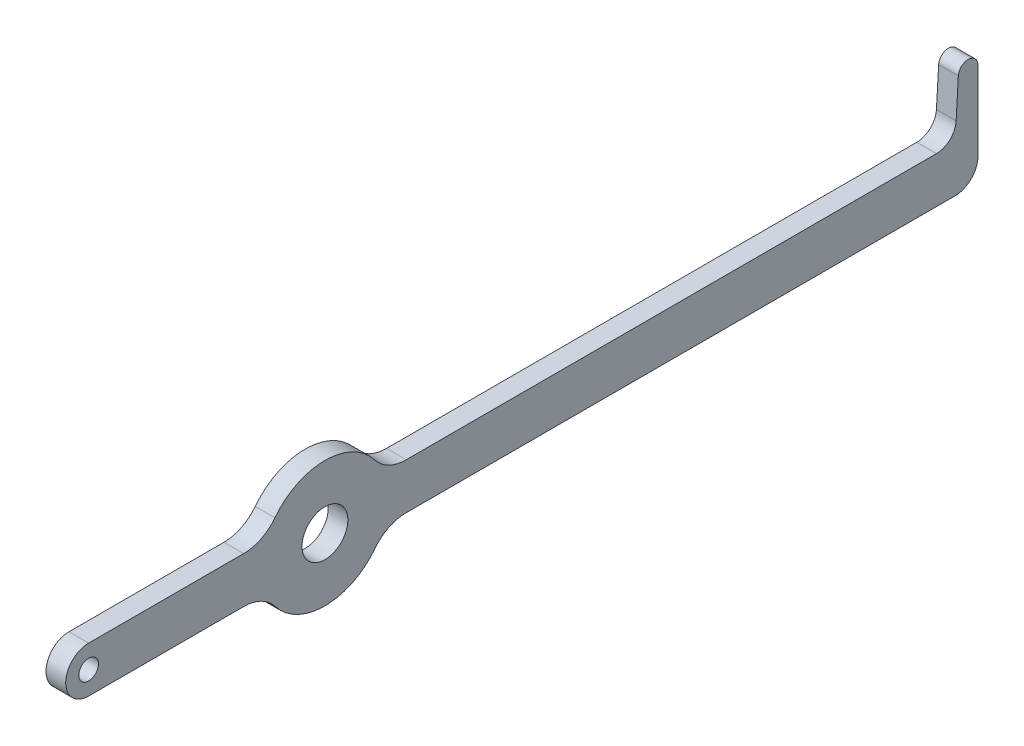
ISO-10303-21;
HEADER;
FILE_DESCRIPTION(('STEP AP214'),'2;1');
FILE_NAME('part.step','',(''),(''),'','','');
FILE_SCHEMA(('AUTOMOTIVE_DESIGN { 1 0 10303 214 1 1 1 1 }'));
ENDSEC;
DATA;
#1=APPLICATION_CONTEXT('core data for automotive mechanical design processes');
#2=APPLICATION_PROTOCOL_DEFINITION('international standard','automotive_design',2000,#1);
#3=PRODUCT_CONTEXT('',#1,'mechanical');
#4=PRODUCT('Part','Part','',(#3));
#5=PRODUCT_RELATED_PRODUCT_CATEGORY('part','',(#4));
#6=PRODUCT_DEFINITION_FORMATION('','',#4);
#7=PRODUCT_DEFINITION_CONTEXT('part definition',#1,'design');
#8=PRODUCT_DEFINITION('design','',#6,#7);
#9=PRODUCT_DEFINITION_SHAPE('','',#8);
#10=(LENGTH_UNIT() NAMED_UNIT(*) SI_UNIT(.MILLI.,.METRE.));
#11=(NAMED_UNIT(*) PLANE_ANGLE_UNIT() SI_UNIT($,.RADIAN.));
#12=(NAMED_UNIT(*) SI_UNIT($,.STERADIAN.) SOLID_ANGLE_UNIT());
#13=UNCERTAINTY_MEASURE_WITH_UNIT(LENGTH_MEASURE(1.E-05),#10,'distance_accuracy_value','');
#14=(GEOMETRIC_REPRESENTATION_CONTEXT(3) GLOBAL_UNCERTAINTY_ASSIGNED_CONTEXT((#13)) GLOBAL_UNIT_ASSIGNED_CONTEXT((#10,
#11,#12)) REPRESENTATION_CONTEXT('',''));
#15=CARTESIAN_POINT('',(0.,0.,0.));
#16=DIRECTION('',(0.,0.,1.));
#17=DIRECTION('',(1.,0.,0.));
#18=AXIS2_PLACEMENT_3D('',#15,#16,#17);
#19=CARTESIAN_POINT('',(1.5875,0.,-101.6));
#20=DIRECTION('',(-1.,0.,0.));
#21=DIRECTION('',(0.,0.,1.));
#22=AXIS2_PLACEMENT_3D('',#19,#20,#21);
#23=CYLINDRICAL_SURFACE('',#22,3.69803375805953);
#24=DIRECTION('',(1.,0.,0.));
#25=VECTOR('',#24,1.);
#26=CARTESIAN_POINT('',(-1.5875,0.,-105.29803375806));
#27=LINE('',#26,#25);
#28=CARTESIAN_POINT('',(-1.5875,0.,-105.29803375806));
#29=VERTEX_POINT('',#28);
#30=CARTESIAN_POINT('',(1.5875,0.,-105.29803375806));
#31=VERTEX_POINT('',#30);
#32=EDGE_CURVE('E170',#29,#31,#27,.T.);
#33=ORIENTED_EDGE('',*,*,#32,.T.);
#34=CARTESIAN_POINT('',(1.5875,0.,-101.6));
#35=DIRECTION('',(1.,0.,0.));
#36=DIRECTION('',(0.,0.,-1.));
#37=AXIS2_PLACEMENT_3D('',#34,#35,#36);
#38=CIRCLE('',#37,3.69803375805953);
#39=CARTESIAN_POINT('',(1.5875,-3.69803375805953,-101.6));
#40=VERTEX_POINT('',#39);
#41=EDGE_CURVE('E351',#40,#31,#38,.T.);
#42=ORIENTED_EDGE('',*,*,#41,.F.);
#43=DIRECTION('',(-1.,0.,0.));
#44=VECTOR('',#43,1.);
#45=CARTESIAN_POINT('',(1.5875,-3.69803375805953,-101.6));
#46=LINE('',#45,#44);
#47=CARTESIAN_POINT('',(-1.5875,-3.69803375805953,-101.6));
#48=VERTEX_POINT('',#47);
#49=EDGE_CURVE('E277',#40,#48,#46,.T.);
#50=ORIENTED_EDGE('',*,*,#49,.T.);
#51=CARTESIAN_POINT('',(-1.5875,0.,-101.6));
#52=DIRECTION('',(1.,0.,0.));
#53=DIRECTION('',(0.,0.,-1.));
#54=AXIS2_PLACEMENT_3D('',#51,#52,#53);
#55=CIRCLE('',#54,3.69803375805953);
#56=EDGE_CURVE('E247',#48,#29,#55,.T.);
#57=ORIENTED_EDGE('',*,*,#56,.T.);
#58=EDGE_LOOP('',(#33,#42,#50,#57));
#59=FACE_BOUND('',#58,.T.);
#60=ADVANCED_FACE('F44',(#59),#23,.T.);
#61=CARTESIAN_POINT('',(1.5875,0.,0.));
#62=DIRECTION('',(-1.,0.,0.));
#63=DIRECTION('',(0.,0.,1.));
#64=AXIS2_PLACEMENT_3D('',#61,#62,#63);
#65=CYLINDRICAL_SURFACE('',#64,10.16);
#66=CARTESIAN_POINT('',(-1.5875,0.,0.));
#67=DIRECTION('',(1.,0.,0.));
#68=DIRECTION('',(0.,0.,-1.));
#69=AXIS2_PLACEMENT_3D('',#66,#67,#68);
#70=CIRCLE('',#69,10.16);
#71=CARTESIAN_POINT('',(-1.5875,-6.1834053895751,8.06170563765347));
#72=VERTEX_POINT('',#71);
#73=CARTESIAN_POINT('',(-1.5875,-6.1834053895751,-8.06170563765347));
#74=VERTEX_POINT('',#73);
#75=EDGE_CURVE('E212',#72,#74,#70,.T.);
#76=ORIENTED_EDGE('',*,*,#75,.T.);
#77=DIRECTION('',(-1.,0.,0.));
#78=VECTOR('',#77,1.);
#79=CARTESIAN_POINT('',(1.5875,-6.1834053895751,-8.06170563765347));
#80=LINE('',#79,#78);
#81=CARTESIAN_POINT('',(1.5875,-6.1834053895751,-8.06170563765347));
#82=VERTEX_POINT('',#81);
#83=EDGE_CURVE('E299',#74,#82,#80,.F.);
#84=ORIENTED_EDGE('',*,*,#83,.T.);
#85=CARTESIAN_POINT('',(1.5875,0.,0.));
#86=DIRECTION('',(1.,0.,0.));
#87=DIRECTION('',(0.,0.,-1.));
#88=AXIS2_PLACEMENT_3D('',#85,#86,#87);
#89=CIRCLE('',#88,10.16);
#90=CARTESIAN_POINT('',(1.5875,-6.1834053895751,8.06170563765347));
#91=VERTEX_POINT('',#90);
#92=EDGE_CURVE('E216',#91,#82,#89,.T.);
#93=ORIENTED_EDGE('',*,*,#92,.F.);
#94=DIRECTION('',(-1.,0.,0.));
#95=VECTOR('',#94,1.);
#96=CARTESIAN_POINT('',(1.5875,-6.1834053895751,8.06170563765347));
#97=LINE('',#96,#95);
#98=EDGE_CURVE('E295',#91,#72,#97,.T.);
#99=ORIENTED_EDGE('',*,*,#98,.T.);
#100=EDGE_LOOP('',(#76,#84,#93,#99));
#101=FACE_BOUND('',#100,.T.);
#102=ADVANCED_FACE('F370',(#101),#65,.T.);
#103=CARTESIAN_POINT('',(1.5875,-3.69803375805953,0.));
#104=DIRECTION('',(0.,1.,0.));
#105=DIRECTION('',(0.,0.,1.));
#106=AXIS2_PLACEMENT_3D('',#103,#104,#105);
#107=PLANE('',#106);
#108=DIRECTION('',(0.,0.,-1.));
#109=VECTOR('',#108,1.);
#110=CARTESIAN_POINT('',(1.5875,-3.69803375805953,0.));
#111=LINE('',#110,#109);
#112=CARTESIAN_POINT('',(1.5875,-3.69803375805953,-13.1002716611869));
#113=VERTEX_POINT('',#112);
#114=EDGE_CURVE('E221',#113,#40,#111,.T.);
#115=ORIENTED_EDGE('',*,*,#114,.F.);
#116=DIRECTION('',(1.,0.,0.));
#117=VECTOR('',#116,1.);
#118=CARTESIAN_POINT('',(-1.5875,-3.69803375805953,-13.1002716611869));
#119=LINE('',#118,#117);
#120=CARTESIAN_POINT('',(-1.5875,-3.69803375805953,-13.1002716611869));
#121=VERTEX_POINT('',#120);
#122=EDGE_CURVE('E291',#113,#121,#119,.F.);
#123=ORIENTED_EDGE('',*,*,#122,.T.);
#124=DIRECTION('',(0.,0.,-1.));
#125=VECTOR('',#124,1.);
#126=CARTESIAN_POINT('',(-1.5875,-3.69803375805953,0.));
#127=LINE('',#126,#125);
#128=EDGE_CURVE('E244',#121,#48,#127,.T.);
#129=ORIENTED_EDGE('',*,*,#128,.T.);
#130=ORIENTED_EDGE('',*,*,#49,.F.);
#131=EDGE_LOOP('',(#115,#123,#129,#130));
#132=FACE_BOUND('',#131,.T.);
#133=ADVANCED_FACE('F364',(#132),#107,.F.);
#134=CARTESIAN_POINT('',(1.5875,3.69803375805953,0.));
#135=DIRECTION('',(0.,1.,0.));
#136=DIRECTION('',(0.,0.,1.));
#137=AXIS2_PLACEMENT_3D('',#134,#135,#136);
#138=PLANE('',#137);
#139=DIRECTION('',(0.,0.,-1.));
#140=VECTOR('',#139,1.);
#141=CARTESIAN_POINT('',(1.5875,3.69803375805953,0.));
#142=LINE('',#141,#140);
#143=CARTESIAN_POINT('',(1.5875,3.69803375805953,-13.1002716611869));
#144=VERTEX_POINT('',#143);
#145=CARTESIAN_POINT('',(1.5875,3.69803375805953,-98.6032390425791));
#146=VERTEX_POINT('',#145);
#147=EDGE_CURVE('E347',#144,#146,#142,.T.);
#148=ORIENTED_EDGE('',*,*,#147,.T.);
#149=DIRECTION('',(-1.,0.,0.));
#150=VECTOR('',#149,1.);
#151=CARTESIAN_POINT('',(-1.5875,3.69803375805953,-98.6032390425791));
#152=LINE('',#151,#150);
#153=CARTESIAN_POINT('',(-1.5875,3.69803375805953,-98.6032390425791));
#154=VERTEX_POINT('',#153);
#155=EDGE_CURVE('E333',#146,#154,#152,.T.);
#156=ORIENTED_EDGE('',*,*,#155,.T.);
#157=DIRECTION('',(0.,0.,-1.));
#158=VECTOR('',#157,1.);
#159=CARTESIAN_POINT('',(-1.5875,3.69803375805953,0.));
#160=LINE('',#159,#158);
#161=CARTESIAN_POINT('',(-1.5875,3.69803375805953,-13.1002716611869));
#162=VERTEX_POINT('',#161);
#163=EDGE_CURVE('E250',#162,#154,#160,.T.);
#164=ORIENTED_EDGE('',*,*,#163,.F.);
#165=DIRECTION('',(-1.,0.,0.));
#166=VECTOR('',#165,1.);
#167=CARTESIAN_POINT('',(1.5875,3.69803375805953,-13.1002716611869));
#168=LINE('',#167,#166);
#169=EDGE_CURVE('E288',#162,#144,#168,.F.);
#170=ORIENTED_EDGE('',*,*,#169,.T.);
#171=EDGE_LOOP('',(#148,#156,#164,#170));
#172=FACE_BOUND('',#171,.T.);
#173=ADVANCED_FACE('F395',(#172),#138,.T.);
#174=CARTESIAN_POINT('',(1.5875,0.,0.));
#175=DIRECTION('',(-1.,0.,0.));
#176=DIRECTION('',(0.,0.,1.));
#177=AXIS2_PLACEMENT_3D('',#174,#175,#176);
#178=CYLINDRICAL_SURFACE('',#177,10.16);
#179=CARTESIAN_POINT('',(1.5875,0.,0.));
#180=DIRECTION('',(1.,0.,0.));
#181=DIRECTION('',(0.,0.,-1.));
#182=AXIS2_PLACEMENT_3D('',#179,#180,#181);
#183=CIRCLE('',#182,10.16);
#184=CARTESIAN_POINT('',(1.5875,6.1834053895751,-8.06170563765347));
#185=VERTEX_POINT('',#184);
#186=CARTESIAN_POINT('',(1.5875,6.1834053895751,8.06170563765347));
#187=VERTEX_POINT('',#186);
#188=EDGE_CURVE('E344',#185,#187,#183,.T.);
#189=ORIENTED_EDGE('',*,*,#188,.F.);
#190=DIRECTION('',(-1.,0.,0.));
#191=VECTOR('',#190,1.);
#192=CARTESIAN_POINT('',(1.5875,6.1834053895751,-8.06170563765347));
#193=LINE('',#192,#191);
#194=CARTESIAN_POINT('',(-1.5875,6.1834053895751,-8.06170563765347));
#195=VERTEX_POINT('',#194);
#196=EDGE_CURVE('E284',#185,#195,#193,.T.);
#197=ORIENTED_EDGE('',*,*,#196,.T.);
#198=CARTESIAN_POINT('',(-1.5875,0.,0.));
#199=DIRECTION('',(1.,0.,0.));
#200=DIRECTION('',(0.,0.,-1.));
#201=AXIS2_PLACEMENT_3D('',#198,#199,#200);
#202=CIRCLE('',#201,10.16);
#203=CARTESIAN_POINT('',(-1.5875,6.1834053895751,8.06170563765347));
#204=VERTEX_POINT('',#203);
#205=EDGE_CURVE('E253',#195,#204,#202,.T.);
#206=ORIENTED_EDGE('',*,*,#205,.T.);
#207=DIRECTION('',(-1.,0.,0.));
#208=VECTOR('',#207,1.);
#209=CARTESIAN_POINT('',(1.5875,6.1834053895751,8.06170563765347));
#210=LINE('',#209,#208);
#211=EDGE_CURVE('E281',#204,#187,#210,.F.);
#212=ORIENTED_EDGE('',*,*,#211,.T.);
#213=EDGE_LOOP('',(#189,#197,#206,#212));
#214=FACE_BOUND('',#213,.T.);
#215=ADVANCED_FACE('F401',(#214),#178,.T.);
#216=CARTESIAN_POINT('',(1.5875,3.69803375805953,0.));
#217=DIRECTION('',(0.,-1.,0.));
#218=DIRECTION('',(0.,0.,-1.));
#219=AXIS2_PLACEMENT_3D('',#216,#217,#218);
#220=PLANE('',#219);
#221=DIRECTION('',(0.,0.,1.));
#222=VECTOR('',#221,1.);
#223=CARTESIAN_POINT('',(1.5875,3.69803375805953,0.));
#224=LINE('',#223,#222);
#225=CARTESIAN_POINT('',(1.5875,3.69803375805953,13.1002716611869));
#226=VERTEX_POINT('',#225);
#227=CARTESIAN_POINT('',(1.5875,3.69803375805953,38.1));
#228=VERTEX_POINT('',#227);
#229=EDGE_CURVE('E342',#226,#228,#224,.T.);
#230=ORIENTED_EDGE('',*,*,#229,.F.);
#231=DIRECTION('',(1.,0.,0.));
#232=VECTOR('',#231,1.);
#233=CARTESIAN_POINT('',(-1.5875,3.69803375805953,13.1002716611869));
#234=LINE('',#233,#232);
#235=CARTESIAN_POINT('',(-1.5875,3.69803375805953,13.1002716611869));
#236=VERTEX_POINT('',#235);
#237=EDGE_CURVE('E305',#226,#236,#234,.F.);
#238=ORIENTED_EDGE('',*,*,#237,.T.);
#239=DIRECTION('',(0.,0.,1.));
#240=VECTOR('',#239,1.);
#241=CARTESIAN_POINT('',(-1.5875,3.69803375805953,0.));
#242=LINE('',#241,#240);
#243=CARTESIAN_POINT('',(-1.5875,3.69803375805953,38.1));
#244=VERTEX_POINT('',#243);
#245=EDGE_CURVE('E257',#236,#244,#242,.T.);
#246=ORIENTED_EDGE('',*,*,#245,.T.);
#247=DIRECTION('',(-1.,0.,0.));
#248=VECTOR('',#247,1.);
#249=CARTESIAN_POINT('',(1.5875,3.69803375805953,38.1));
#250=LINE('',#249,#248);
#251=EDGE_CURVE('E273',#228,#244,#250,.T.);
#252=ORIENTED_EDGE('',*,*,#251,.F.);
#253=EDGE_LOOP('',(#230,#238,#246,#252));
#254=FACE_BOUND('',#253,.T.);
#255=ADVANCED_FACE('F406',(#254),#220,.F.);
#256=CARTESIAN_POINT('',(1.5875,0.,38.1));
#257=DIRECTION('',(-1.,0.,0.));
#258=DIRECTION('',(0.,0.,1.));
#259=AXIS2_PLACEMENT_3D('',#256,#257,#258);
#260=CYLINDRICAL_SURFACE('',#259,3.69803375805953);
#261=CARTESIAN_POINT('',(-1.5875,0.,38.1));
#262=DIRECTION('',(1.,0.,0.));
#263=DIRECTION('',(0.,0.,-1.));
#264=AXIS2_PLACEMENT_3D('',#261,#262,#263);
#265=CIRCLE('',#264,3.69803375805953);
#266=CARTESIAN_POINT('',(-1.5875,-3.69803375805953,38.1));
#267=VERTEX_POINT('',#266);
#268=EDGE_CURVE('E260',#244,#267,#265,.T.);
#269=ORIENTED_EDGE('',*,*,#268,.T.);
#270=DIRECTION('',(-1.,0.,0.));
#271=VECTOR('',#270,1.);
#272=CARTESIAN_POINT('',(1.5875,-3.69803375805953,38.1));
#273=LINE('',#272,#271);
#274=CARTESIAN_POINT('',(1.5875,-3.69803375805953,38.1));
#275=VERTEX_POINT('',#274);
#276=EDGE_CURVE('E240',#275,#267,#273,.T.);
#277=ORIENTED_EDGE('',*,*,#276,.F.);
#278=CARTESIAN_POINT('',(1.5875,0.,38.1));
#279=DIRECTION('',(1.,0.,0.));
#280=DIRECTION('',(0.,0.,-1.));
#281=AXIS2_PLACEMENT_3D('',#278,#279,#280);
#282=CIRCLE('',#281,3.69803375805953);
#283=EDGE_CURVE('E233',#228,#275,#282,.T.);
#284=ORIENTED_EDGE('',*,*,#283,.F.);
#285=ORIENTED_EDGE('',*,*,#251,.T.);
#286=EDGE_LOOP('',(#269,#277,#284,#285));
#287=FACE_BOUND('',#286,.T.);
#288=ADVANCED_FACE('F442',(#287),#260,.T.);
#289=CARTESIAN_POINT('',(1.5875,-3.69803375805953,0.));
#290=DIRECTION('',(0.,-1.,0.));
#291=DIRECTION('',(0.,0.,-1.));
#292=AXIS2_PLACEMENT_3D('',#289,#290,#291);
#293=PLANE('',#292);
#294=DIRECTION('',(0.,0.,1.));
#295=VECTOR('',#294,1.);
#296=CARTESIAN_POINT('',(-1.5875,-3.69803375805953,0.));
#297=LINE('',#296,#295);
#298=CARTESIAN_POINT('',(-1.5875,-3.69803375805953,13.1002716611869));
#299=VERTEX_POINT('',#298);
#300=EDGE_CURVE('E264',#299,#267,#297,.T.);
#301=ORIENTED_EDGE('',*,*,#300,.F.);
#302=DIRECTION('',(-1.,0.,0.));
#303=VECTOR('',#302,1.);
#304=CARTESIAN_POINT('',(1.5875,-3.69803375805953,13.1002716611869));
#305=LINE('',#304,#303);
#306=CARTESIAN_POINT('',(1.5875,-3.69803375805953,13.1002716611869));
#307=VERTEX_POINT('',#306);
#308=EDGE_CURVE('E302',#299,#307,#305,.F.);
#309=ORIENTED_EDGE('',*,*,#308,.T.);
#310=DIRECTION('',(0.,0.,1.));
#311=VECTOR('',#310,1.);
#312=CARTESIAN_POINT('',(1.5875,-3.69803375805953,0.));
#313=LINE('',#312,#311);
#314=EDGE_CURVE('E228',#307,#275,#313,.T.);
#315=ORIENTED_EDGE('',*,*,#314,.T.);
#316=ORIENTED_EDGE('',*,*,#276,.T.);
#317=EDGE_LOOP('',(#301,#309,#315,#316));
#318=FACE_BOUND('',#317,.T.);
#319=ADVANCED_FACE('F438',(#318),#293,.T.);
#320=CARTESIAN_POINT('',(1.5875,0.,0.));
#321=DIRECTION('',(-1.,0.,0.));
#322=DIRECTION('',(0.,0.,1.));
#323=AXIS2_PLACEMENT_3D('',#320,#321,#322);
#324=CYLINDRICAL_SURFACE('',#323,3.69803375805953);
#325=CARTESIAN_POINT('',(1.5875,0.,0.));
#326=DIRECTION('',(1.,0.,0.));
#327=DIRECTION('',(0.,0.,-1.));
#328=AXIS2_PLACEMENT_3D('',#325,#326,#327);
#329=CIRCLE('',#328,3.69803375805953);
#330=CARTESIAN_POINT('',(1.5875,0.,-3.69803375805953));
#331=VERTEX_POINT('',#330);
#332=EDGE_CURVE('E232',#331,#331,#329,.T.);
#333=ORIENTED_EDGE('',*,*,#332,.T.);
#334=EDGE_LOOP('',(#333));
#335=FACE_BOUND('',#334,.T.);
#336=CARTESIAN_POINT('',(-1.5875,0.,0.));
#337=DIRECTION('',(1.,0.,0.));
#338=DIRECTION('',(0.,0.,-1.));
#339=AXIS2_PLACEMENT_3D('',#336,#337,#338);
#340=CIRCLE('',#339,3.69803375805953);
#341=CARTESIAN_POINT('',(-1.5875,0.,-3.69803375805953));
#342=VERTEX_POINT('',#341);
#343=EDGE_CURVE('E222',#342,#342,#340,.T.);
#344=ORIENTED_EDGE('',*,*,#343,.F.);
#345=EDGE_LOOP('',(#344));
#346=FACE_BOUND('',#345,.T.);
#347=ADVANCED_FACE('F431',(#335,#346),#324,.F.);
#348=CARTESIAN_POINT('',(1.5875,0.,0.));
#349=DIRECTION('',(1.,0.,0.));
#350=DIRECTION('',(0.,0.,-1.));
#351=AXIS2_PLACEMENT_3D('',#348,#349,#350);
#352=PLANE('',#351);
#353=CARTESIAN_POINT('',(1.5875,0.,38.1));
#354=DIRECTION('',(1.,0.,0.));
#355=DIRECTION('',(0.,0.,-1.));
#356=AXIS2_PLACEMENT_3D('',#353,#354,#355);
#357=CIRCLE('',#356,1.5875);
#358=CARTESIAN_POINT('',(1.5875,0.,36.5125));
#359=VERTEX_POINT('',#358);
#360=EDGE_CURVE('E189',#359,#359,#357,.T.);
#361=ORIENTED_EDGE('',*,*,#360,.F.);
#362=EDGE_LOOP('',(#361));
#363=FACE_BOUND('',#362,.T.);
#364=ORIENTED_EDGE('',*,*,#314,.F.);
#365=CARTESIAN_POINT('',(1.5875,-10.0480337580595,13.1002716611869));
#366=DIRECTION('',(1.,0.,0.));
#367=DIRECTION('',(0.,0.,-1.));
#368=AXIS2_PLACEMENT_3D('',#365,#366,#367);
#369=CIRCLE('',#368,6.35);
#370=EDGE_CURVE('E324',#307,#91,#369,.F.);
#371=ORIENTED_EDGE('',*,*,#370,.T.);
#372=ORIENTED_EDGE('',*,*,#92,.T.);
#373=CARTESIAN_POINT('',(1.5875,-10.0480337580595,-13.1002716611869));
#374=DIRECTION('',(1.,0.,0.));
#375=DIRECTION('',(0.,0.,-1.));
#376=AXIS2_PLACEMENT_3D('',#373,#374,#375);
#377=CIRCLE('',#376,6.35);
#378=EDGE_CURVE('E318',#82,#113,#377,.F.);
#379=ORIENTED_EDGE('',*,*,#378,.T.);
#380=ORIENTED_EDGE('',*,*,#114,.T.);
#381=ORIENTED_EDGE('',*,*,#41,.T.);
#382=DIRECTION('',(0.,1.,0.));
#383=VECTOR('',#382,1.);
#384=CARTESIAN_POINT('',(1.5875,0.,-105.29803375806));
#385=LINE('',#384,#383);
#386=CARTESIAN_POINT('',(1.5875,12.7,-105.29803375806));
#387=VERTEX_POINT('',#386);
#388=EDGE_CURVE('E195',#31,#387,#385,.T.);
#389=ORIENTED_EDGE('',*,*,#388,.T.);
#390=CARTESIAN_POINT('',(1.5875,12.7,-103.71053375806));
#391=DIRECTION('',(1.,0.,0.));
#392=DIRECTION('',(0.,0.,-1.));
#393=AXIS2_PLACEMENT_3D('',#390,#391,#392);
#394=CIRCLE('',#393,1.58750000000001);
#395=CARTESIAN_POINT('',(1.5875,12.791616860415,-102.125679632));
#396=VERTEX_POINT('',#395);
#397=EDGE_CURVE('E163',#387,#396,#394,.T.);
#398=ORIENTED_EDGE('',*,*,#397,.T.);
#399=DIRECTION('',(0.,-0.998333307753991,0.0577114081354328));
#400=VECTOR('',#399,1.);
#401=CARTESIAN_POINT('',(1.5875,3.69803375805953,-101.6));
#402=LINE('',#401,#400);
#403=CARTESIAN_POINT('',(1.5875,6.68980003722953,-101.772947294698));
#404=VERTEX_POINT('',#403);
#405=EDGE_CURVE('E184',#396,#404,#402,.T.);
#406=ORIENTED_EDGE('',*,*,#405,.T.);
#407=CARTESIAN_POINT('',(1.5875,6.87303375805953,-98.6032390425791));
#408=DIRECTION('',(1.,0.,0.));
#409=DIRECTION('',(0.,0.,-1.));
#410=AXIS2_PLACEMENT_3D('',#407,#408,#409);
#411=CIRCLE('',#410,3.175);
#412=EDGE_CURVE('E12',#404,#146,#411,.F.);
#413=ORIENTED_EDGE('',*,*,#412,.T.);
#414=ORIENTED_EDGE('',*,*,#147,.F.);
#415=CARTESIAN_POINT('',(1.5875,10.0480337580595,-13.1002716611869));
#416=DIRECTION('',(1.,0.,0.));
#417=DIRECTION('',(0.,0.,-1.));
#418=AXIS2_PLACEMENT_3D('',#415,#416,#417);
#419=CIRCLE('',#418,6.35);
#420=EDGE_CURVE('E312',#144,#185,#419,.F.);
#421=ORIENTED_EDGE('',*,*,#420,.T.);
#422=ORIENTED_EDGE('',*,*,#188,.T.);
#423=CARTESIAN_POINT('',(1.5875,10.0480337580595,13.1002716611869));
#424=DIRECTION('',(1.,0.,0.));
#425=DIRECTION('',(0.,0.,-1.));
#426=AXIS2_PLACEMENT_3D('',#423,#424,#425);
#427=CIRCLE('',#426,6.35);
#428=EDGE_CURVE('E330',#187,#226,#427,.F.);
#429=ORIENTED_EDGE('',*,*,#428,.T.);
#430=ORIENTED_EDGE('',*,*,#229,.T.);
#431=ORIENTED_EDGE('',*,*,#283,.T.);
#432=EDGE_LOOP('',(#364,#371,#372,#379,#380,#381,#389,#398,#406,#413,#414,#421,#422,#429,#430,#431));
#433=FACE_BOUND('',#432,.T.);
#434=ORIENTED_EDGE('',*,*,#332,.F.);
#435=EDGE_LOOP('',(#434));
#436=FACE_BOUND('',#435,.T.);
#437=ADVANCED_FACE('F358',(#363,#433,#436),#352,.T.);
#438=CARTESIAN_POINT('',(-1.5875,0.,0.));
#439=DIRECTION('',(1.,0.,0.));
#440=DIRECTION('',(0.,0.,-1.));
#441=AXIS2_PLACEMENT_3D('',#438,#439,#440);
#442=PLANE('',#441);
#443=CARTESIAN_POINT('',(-1.5875,0.,38.1));
#444=DIRECTION('',(1.,0.,0.));
#445=DIRECTION('',(0.,0.,-1.));
#446=AXIS2_PLACEMENT_3D('',#443,#444,#445);
#447=CIRCLE('',#446,1.5875);
#448=CARTESIAN_POINT('',(-1.5875,0.,36.5125));
#449=VERTEX_POINT('',#448);
#450=EDGE_CURVE('E560',#449,#449,#447,.T.);
#451=ORIENTED_EDGE('',*,*,#450,.T.);
#452=EDGE_LOOP('',(#451));
#453=FACE_BOUND('',#452,.T.);
#454=ORIENTED_EDGE('',*,*,#75,.F.);
#455=CARTESIAN_POINT('',(-1.5875,-10.0480337580595,13.1002716611869));
#456=DIRECTION('',(1.,0.,0.));
#457=DIRECTION('',(0.,0.,-1.));
#458=AXIS2_PLACEMENT_3D('',#455,#456,#457);
#459=CIRCLE('',#458,6.35);
#460=EDGE_CURVE('E321',#72,#299,#459,.T.);
#461=ORIENTED_EDGE('',*,*,#460,.T.);
#462=ORIENTED_EDGE('',*,*,#300,.T.);
#463=ORIENTED_EDGE('',*,*,#268,.F.);
#464=ORIENTED_EDGE('',*,*,#245,.F.);
#465=CARTESIAN_POINT('',(-1.5875,10.0480337580595,13.1002716611869));
#466=DIRECTION('',(1.,0.,0.));
#467=DIRECTION('',(0.,0.,-1.));
#468=AXIS2_PLACEMENT_3D('',#465,#466,#467);
#469=CIRCLE('',#468,6.35);
#470=EDGE_CURVE('E327',#236,#204,#469,.T.);
#471=ORIENTED_EDGE('',*,*,#470,.T.);
#472=ORIENTED_EDGE('',*,*,#205,.F.);
#473=CARTESIAN_POINT('',(-1.5875,10.0480337580595,-13.1002716611869));
#474=DIRECTION('',(1.,0.,0.));
#475=DIRECTION('',(0.,0.,-1.));
#476=AXIS2_PLACEMENT_3D('',#473,#474,#475);
#477=CIRCLE('',#476,6.35);
#478=EDGE_CURVE('E309',#195,#162,#477,.T.);
#479=ORIENTED_EDGE('',*,*,#478,.T.);
#480=ORIENTED_EDGE('',*,*,#163,.T.);
#481=CARTESIAN_POINT('',(-1.5875,6.87303375805953,-98.6032390425791));
#482=DIRECTION('',(1.,0.,0.));
#483=DIRECTION('',(0.,0.,-1.));
#484=AXIS2_PLACEMENT_3D('',#481,#482,#483);
#485=CIRCLE('',#484,3.175);
#486=CARTESIAN_POINT('',(-1.5875,6.68980003722953,-101.772947294698));
#487=VERTEX_POINT('',#486);
#488=EDGE_CURVE('E53',#154,#487,#485,.T.);
#489=ORIENTED_EDGE('',*,*,#488,.T.);
#490=DIRECTION('',(0.,-0.998333307753991,0.0577114081354328));
#491=VECTOR('',#490,1.);
#492=CARTESIAN_POINT('',(-1.5875,3.69803375805953,-101.6));
#493=LINE('',#492,#491);
#494=CARTESIAN_POINT('',(-1.5875,12.791616860415,-102.125679632));
#495=VERTEX_POINT('',#494);
#496=EDGE_CURVE('E178',#495,#487,#493,.T.);
#497=ORIENTED_EDGE('',*,*,#496,.F.);
#498=CARTESIAN_POINT('',(-1.5875,12.7,-103.71053375806));
#499=DIRECTION('',(1.,0.,0.));
#500=DIRECTION('',(0.,0.,-1.));
#501=AXIS2_PLACEMENT_3D('',#498,#499,#500);
#502=CIRCLE('',#501,1.58750000000001);
#503=CARTESIAN_POINT('',(-1.5875,12.7,-105.29803375806));
#504=VERTEX_POINT('',#503);
#505=EDGE_CURVE('E161',#504,#495,#502,.T.);
#506=ORIENTED_EDGE('',*,*,#505,.F.);
#507=DIRECTION('',(0.,1.,0.));
#508=VECTOR('',#507,1.);
#509=CARTESIAN_POINT('',(-1.5875,0.,-105.29803375806));
#510=LINE('',#509,#508);
#511=EDGE_CURVE('E177',#29,#504,#510,.T.);
#512=ORIENTED_EDGE('',*,*,#511,.F.);
#513=ORIENTED_EDGE('',*,*,#56,.F.);
#514=ORIENTED_EDGE('',*,*,#128,.F.);
#515=CARTESIAN_POINT('',(-1.5875,-10.0480337580595,-13.1002716611869));
#516=DIRECTION('',(1.,0.,0.));
#517=DIRECTION('',(0.,0.,-1.));
#518=AXIS2_PLACEMENT_3D('',#515,#516,#517);
#519=CIRCLE('',#518,6.35);
#520=EDGE_CURVE('E315',#121,#74,#519,.T.);
#521=ORIENTED_EDGE('',*,*,#520,.T.);
#522=EDGE_LOOP('',(#454,#461,#462,#463,#464,#471,#472,#479,#480,#489,#497,#506,#512,#513,#514,#521));
#523=FACE_BOUND('',#522,.T.);
#524=ORIENTED_EDGE('',*,*,#343,.T.);
#525=EDGE_LOOP('',(#524));
#526=FACE_BOUND('',#525,.T.);
#527=ADVANCED_FACE('F174',(#453,#523,#526),#442,.F.);
#528=CARTESIAN_POINT('',(1.5875,10.0480337580595,-13.1002716611869));
#529=DIRECTION('',(-1.,0.,0.));
#530=DIRECTION('',(0.,0.,1.));
#531=AXIS2_PLACEMENT_3D('',#528,#529,#530);
#532=CYLINDRICAL_SURFACE('',#531,6.35);
#533=ORIENTED_EDGE('',*,*,#420,.F.);
#534=ORIENTED_EDGE('',*,*,#169,.F.);
#535=ORIENTED_EDGE('',*,*,#478,.F.);
#536=ORIENTED_EDGE('',*,*,#196,.F.);
#537=EDGE_LOOP('',(#533,#534,#535,#536));
#538=FACE_BOUND('',#537,.T.);
#539=ADVANCED_FACE('F376',(#538),#532,.F.);
#540=CARTESIAN_POINT('',(1.5875,-10.0480337580595,-13.1002716611869));
#541=DIRECTION('',(-1.,0.,0.));
#542=DIRECTION('',(0.,0.,1.));
#543=AXIS2_PLACEMENT_3D('',#540,#541,#542);
#544=CYLINDRICAL_SURFACE('',#543,6.35);
#545=ORIENTED_EDGE('',*,*,#378,.F.);
#546=ORIENTED_EDGE('',*,*,#83,.F.);
#547=ORIENTED_EDGE('',*,*,#520,.F.);
#548=ORIENTED_EDGE('',*,*,#122,.F.);
#549=EDGE_LOOP('',(#545,#546,#547,#548));
#550=FACE_BOUND('',#549,.T.);
#551=ADVANCED_FACE('F373',(#550),#544,.F.);
#552=CARTESIAN_POINT('',(1.5875,-10.0480337580595,13.1002716611869));
#553=DIRECTION('',(-1.,0.,0.));
#554=DIRECTION('',(0.,0.,1.));
#555=AXIS2_PLACEMENT_3D('',#552,#553,#554);
#556=CYLINDRICAL_SURFACE('',#555,6.35);
#557=ORIENTED_EDGE('',*,*,#370,.F.);
#558=ORIENTED_EDGE('',*,*,#308,.F.);
#559=ORIENTED_EDGE('',*,*,#460,.F.);
#560=ORIENTED_EDGE('',*,*,#98,.F.);
#561=EDGE_LOOP('',(#557,#558,#559,#560));
#562=FACE_BOUND('',#561,.T.);
#563=ADVANCED_FACE('F375',(#562),#556,.F.);
#564=CARTESIAN_POINT('',(1.5875,10.0480337580595,13.1002716611869));
#565=DIRECTION('',(-1.,0.,0.));
#566=DIRECTION('',(0.,0.,1.));
#567=AXIS2_PLACEMENT_3D('',#564,#565,#566);
#568=CYLINDRICAL_SURFACE('',#567,6.35);
#569=ORIENTED_EDGE('',*,*,#428,.F.);
#570=ORIENTED_EDGE('',*,*,#211,.F.);
#571=ORIENTED_EDGE('',*,*,#470,.F.);
#572=ORIENTED_EDGE('',*,*,#237,.F.);
#573=EDGE_LOOP('',(#569,#570,#571,#572));
#574=FACE_BOUND('',#573,.T.);
#575=ADVANCED_FACE('F382',(#574),#568,.F.);
#576=CARTESIAN_POINT('',(-1.5875,3.69803375805953,-101.6));
#577=DIRECTION('',(0.,0.0577114081354328,0.998333307753991));
#578=DIRECTION('',(0.,-0.998333307753991,0.0577114081354328));
#579=AXIS2_PLACEMENT_3D('',#576,#577,#578);
#580=PLANE('',#579);
#581=ORIENTED_EDGE('',*,*,#496,.T.);
#582=DIRECTION('',(-1.,0.,0.));
#583=VECTOR('',#582,1.);
#584=CARTESIAN_POINT('',(1.5875,6.68980003722953,-101.772947294698));
#585=LINE('',#584,#583);
#586=EDGE_CURVE('E66',#487,#404,#585,.F.);
#587=ORIENTED_EDGE('',*,*,#586,.T.);
#588=ORIENTED_EDGE('',*,*,#405,.F.);
#589=DIRECTION('',(1.,0.,0.));
#590=VECTOR('',#589,1.);
#591=CARTESIAN_POINT('',(-1.5875,12.791616860415,-102.125679632));
#592=LINE('',#591,#590);
#593=EDGE_CURVE('E169',#495,#396,#592,.T.);
#594=ORIENTED_EDGE('',*,*,#593,.F.);
#595=EDGE_LOOP('',(#581,#587,#588,#594));
#596=FACE_BOUND('',#595,.T.);
#597=ADVANCED_FACE('F415',(#596),#580,.T.);
#598=CARTESIAN_POINT('',(-1.5875,12.7,-103.71053375806));
#599=DIRECTION('',(1.,0.,0.));
#600=DIRECTION('',(0.,0.,-1.));
#601=AXIS2_PLACEMENT_3D('',#598,#599,#600);
#602=CYLINDRICAL_SURFACE('',#601,1.58750000000001);
#603=ORIENTED_EDGE('',*,*,#397,.F.);
#604=DIRECTION('',(1.,0.,0.));
#605=VECTOR('',#604,1.);
#606=CARTESIAN_POINT('',(-1.5875,12.7,-105.29803375806));
#607=LINE('',#606,#605);
#608=EDGE_CURVE('E158',#504,#387,#607,.T.);
#609=ORIENTED_EDGE('',*,*,#608,.F.);
#610=ORIENTED_EDGE('',*,*,#505,.T.);
#611=ORIENTED_EDGE('',*,*,#593,.T.);
#612=EDGE_LOOP('',(#603,#609,#610,#611));
#613=FACE_BOUND('',#612,.T.);
#614=ADVANCED_FACE('F160',(#613),#602,.T.);
#615=CARTESIAN_POINT('',(-1.5875,0.,-105.29803375806));
#616=DIRECTION('',(0.,0.,-1.));
#617=DIRECTION('',(-1.,0.,0.));
#618=AXIS2_PLACEMENT_3D('',#615,#616,#617);
#619=PLANE('',#618);
#620=ORIENTED_EDGE('',*,*,#388,.F.);
#621=ORIENTED_EDGE('',*,*,#32,.F.);
#622=ORIENTED_EDGE('',*,*,#511,.T.);
#623=ORIENTED_EDGE('',*,*,#608,.T.);
#624=EDGE_LOOP('',(#620,#621,#622,#623));
#625=FACE_BOUND('',#624,.T.);
#626=ADVANCED_FACE('F182',(#625),#619,.T.);
#627=CARTESIAN_POINT('',(1.5875,6.87303375805953,-98.6032390425791));
#628=DIRECTION('',(1.,0.,0.));
#629=DIRECTION('',(0.,0.,-1.));
#630=AXIS2_PLACEMENT_3D('',#627,#628,#629);
#631=CYLINDRICAL_SURFACE('',#630,3.175);
#632=ORIENTED_EDGE('',*,*,#412,.F.);
#633=ORIENTED_EDGE('',*,*,#586,.F.);
#634=ORIENTED_EDGE('',*,*,#488,.F.);
#635=ORIENTED_EDGE('',*,*,#155,.F.);
#636=EDGE_LOOP('',(#632,#633,#634,#635));
#637=FACE_BOUND('',#636,.T.);
#638=ADVANCED_FACE('F46',(#637),#631,.F.);
#639=CARTESIAN_POINT('',(-1.5875,0.,38.1));
#640=DIRECTION('',(1.,0.,0.));
#641=DIRECTION('',(0.,0.,-1.));
#642=AXIS2_PLACEMENT_3D('',#639,#640,#641);
#643=CYLINDRICAL_SURFACE('',#642,1.5875);
#644=ORIENTED_EDGE('',*,*,#360,.T.);
#645=EDGE_LOOP('',(#644));
#646=FACE_BOUND('',#645,.T.);
#647=ORIENTED_EDGE('',*,*,#450,.F.);
#648=EDGE_LOOP('',(#647));
#649=FACE_BOUND('',#648,.T.);
#650=ADVANCED_FACE('F425',(#646,#649),#643,.F.);
#651=CLOSED_SHELL('',(#60,#102,#133,#173,#215,#255,#288,#319,#347,#437,#527,#539,#551,#563,#575,
#597,#614,#626,#638,#650));
#652=MANIFOLD_SOLID_BREP('B2',#651);
#653=ADVANCED_BREP_SHAPE_REPRESENTATION('',(#18,#652),#14);
#654=SHAPE_DEFINITION_REPRESENTATION(#9,#653);
ENDSEC;
END-ISO-10303-21;
